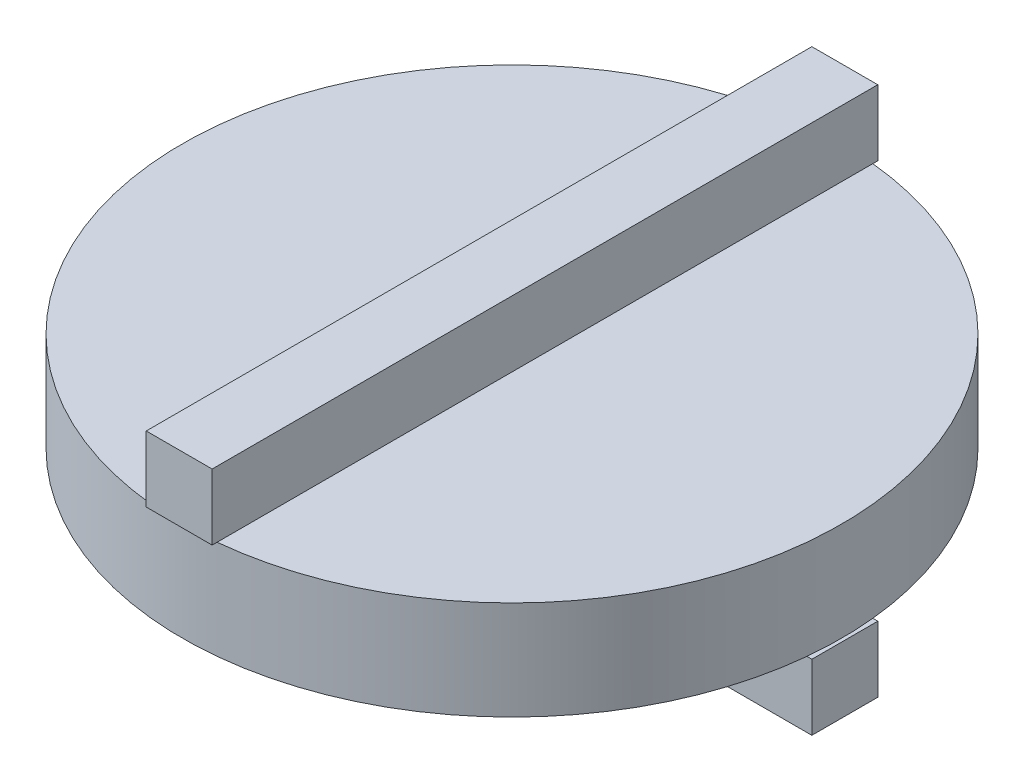
ISO-10303-21;
HEADER;
FILE_DESCRIPTION(('STEP AP214'),'2;1');
FILE_NAME('part.step','',(''),(''),'','','');
FILE_SCHEMA(('AUTOMOTIVE_DESIGN { 1 0 10303 214 1 1 1 1 }'));
ENDSEC;
DATA;
#1=APPLICATION_CONTEXT('core data for automotive mechanical design processes');
#2=APPLICATION_PROTOCOL_DEFINITION('international standard','automotive_design',2000,#1);
#3=PRODUCT_CONTEXT('',#1,'mechanical');
#4=PRODUCT('Part','Part','',(#3));
#5=PRODUCT_RELATED_PRODUCT_CATEGORY('part','',(#4));
#6=PRODUCT_DEFINITION_FORMATION('','',#4);
#7=PRODUCT_DEFINITION_CONTEXT('part definition',#1,'design');
#8=PRODUCT_DEFINITION('design','',#6,#7);
#9=PRODUCT_DEFINITION_SHAPE('','',#8);
#10=(LENGTH_UNIT() NAMED_UNIT(*) SI_UNIT(.MILLI.,.METRE.));
#11=(NAMED_UNIT(*) PLANE_ANGLE_UNIT() SI_UNIT($,.RADIAN.));
#12=(NAMED_UNIT(*) SI_UNIT($,.STERADIAN.) SOLID_ANGLE_UNIT());
#13=UNCERTAINTY_MEASURE_WITH_UNIT(LENGTH_MEASURE(1.E-05),#10,'distance_accuracy_value','');
#14=(GEOMETRIC_REPRESENTATION_CONTEXT(3) GLOBAL_UNCERTAINTY_ASSIGNED_CONTEXT((#13)) GLOBAL_UNIT_ASSIGNED_CONTEXT((#10,
#11,#12)) REPRESENTATION_CONTEXT('',''));
#15=CARTESIAN_POINT('',(0.,0.,0.));
#16=DIRECTION('',(0.,0.,1.));
#17=DIRECTION('',(1.,0.,0.));
#18=AXIS2_PLACEMENT_3D('',#15,#16,#17);
#19=CARTESIAN_POINT('',(0.,0.,0.));
#20=DIRECTION('',(0.,1.,0.));
#21=DIRECTION('',(0.,0.,1.));
#22=AXIS2_PLACEMENT_3D('',#19,#20,#21);
#23=PLANE('',#22);
#24=DIRECTION('',(-1.,0.,0.));
#25=VECTOR('',#24,1.);
#26=CARTESIAN_POINT('',(50.5,0.,5.00000000000001));
#27=LINE('',#26,#25);
#28=CARTESIAN_POINT('',(49.749371855331,0.,5.00000000000001));
#29=VERTEX_POINT('',#28);
#30=CARTESIAN_POINT('',(-49.749371855331,0.,4.99999999999999));
#31=VERTEX_POINT('',#30);
#32=EDGE_CURVE('E11',#29,#31,#27,.T.);
#33=ORIENTED_EDGE('',*,*,#32,.F.);
#34=CARTESIAN_POINT('',(0.,0.,0.));
#35=DIRECTION('',(0.,1.,0.));
#36=DIRECTION('',(0.,0.,1.));
#37=AXIS2_PLACEMENT_3D('',#34,#35,#36);
#38=CIRCLE('',#37,50.);
#39=EDGE_CURVE('E58',#31,#29,#38,.T.);
#40=ORIENTED_EDGE('',*,*,#39,.F.);
#41=EDGE_LOOP('',(#33,#40));
#42=FACE_BOUND('',#41,.T.);
#43=ADVANCED_FACE('F39',(#42),#23,.F.);
#44=DIRECTION('',(1.,0.,0.));
#45=VECTOR('',#44,1.);
#46=CARTESIAN_POINT('',(-50.5,0.,-5.00000000000001));
#47=LINE('',#46,#45);
#48=CARTESIAN_POINT('',(-49.749371855331,0.,-5.00000000000001));
#49=VERTEX_POINT('',#48);
#50=CARTESIAN_POINT('',(49.749371855331,0.,-5.00000000000001));
#51=VERTEX_POINT('',#50);
#52=EDGE_CURVE('E49',#49,#51,#47,.T.);
#53=ORIENTED_EDGE('',*,*,#52,.F.);
#54=EDGE_CURVE('E234',#51,#49,#38,.T.);
#55=ORIENTED_EDGE('',*,*,#54,.F.);
#56=EDGE_LOOP('',(#53,#55));
#57=FACE_BOUND('',#56,.T.);
#58=ADVANCED_FACE('F250',(#57),#23,.F.);
#59=CARTESIAN_POINT('',(0.,15.,0.));
#60=DIRECTION('',(0.,1.,0.));
#61=DIRECTION('',(0.,0.,1.));
#62=AXIS2_PLACEMENT_3D('',#59,#60,#61);
#63=PLANE('',#62);
#64=DIRECTION('',(0.,0.,1.));
#65=VECTOR('',#64,1.);
#66=CARTESIAN_POINT('',(-5.,15.,50.5));
#67=LINE('',#66,#65);
#68=CARTESIAN_POINT('',(-5.,15.,-49.749371855331));
#69=VERTEX_POINT('',#68);
#70=CARTESIAN_POINT('',(-5.,15.,49.749371855331));
#71=VERTEX_POINT('',#70);
#72=EDGE_CURVE('E167',#69,#71,#67,.T.);
#73=ORIENTED_EDGE('',*,*,#72,.F.);
#74=CARTESIAN_POINT('',(0.,15.,0.));
#75=DIRECTION('',(0.,1.,0.));
#76=DIRECTION('',(0.,0.,1.));
#77=AXIS2_PLACEMENT_3D('',#74,#75,#76);
#78=CIRCLE('',#77,50.);
#79=EDGE_CURVE('E225',#69,#71,#78,.T.);
#80=ORIENTED_EDGE('',*,*,#79,.T.);
#81=EDGE_LOOP('',(#73,#80));
#82=FACE_BOUND('',#81,.T.);
#83=ADVANCED_FACE('F254',(#82),#63,.T.);
#84=CARTESIAN_POINT('',(0.,15.,0.));
#85=DIRECTION('',(0.,-1.,0.));
#86=DIRECTION('',(0.,0.,-1.));
#87=AXIS2_PLACEMENT_3D('',#84,#85,#86);
#88=CYLINDRICAL_SURFACE('',#87,50.);
#89=CARTESIAN_POINT('',(5.,15.,49.749371855331));
#90=VERTEX_POINT('',#89);
#91=CARTESIAN_POINT('',(4.99999999999999,15.,-49.749371855331));
#92=VERTEX_POINT('',#91);
#93=EDGE_CURVE('E214',#90,#92,#78,.T.);
#94=ORIENTED_EDGE('',*,*,#93,.F.);
#95=EDGE_CURVE('E217',#71,#90,#78,.T.);
#96=ORIENTED_EDGE('',*,*,#95,.F.);
#97=ORIENTED_EDGE('',*,*,#79,.F.);
#98=EDGE_CURVE('E216',#92,#69,#78,.T.);
#99=ORIENTED_EDGE('',*,*,#98,.F.);
#100=EDGE_LOOP('',(#94,#96,#97,#99));
#101=FACE_BOUND('',#100,.T.);
#102=EDGE_CURVE('E43',#29,#51,#38,.T.);
#103=ORIENTED_EDGE('',*,*,#102,.T.);
#104=ORIENTED_EDGE('',*,*,#54,.T.);
#105=EDGE_CURVE('E238',#49,#31,#38,.T.);
#106=ORIENTED_EDGE('',*,*,#105,.T.);
#107=ORIENTED_EDGE('',*,*,#39,.T.);
#108=EDGE_LOOP('',(#103,#104,#106,#107));
#109=FACE_BOUND('',#108,.T.);
#110=ADVANCED_FACE('F41',(#101,#109),#88,.T.);
#111=DIRECTION('',(0.,0.,-1.));
#112=VECTOR('',#111,1.);
#113=CARTESIAN_POINT('',(4.99999999999999,15.,-50.5));
#114=LINE('',#113,#112);
#115=EDGE_CURVE('E197',#90,#92,#114,.T.);
#116=ORIENTED_EDGE('',*,*,#115,.F.);
#117=ORIENTED_EDGE('',*,*,#93,.T.);
#118=EDGE_LOOP('',(#116,#117));
#119=FACE_BOUND('',#118,.T.);
#120=ADVANCED_FACE('F256',(#119),#63,.T.);
#121=CARTESIAN_POINT('',(0.,15.,0.));
#122=DIRECTION('',(0.,-1.,0.));
#123=DIRECTION('',(0.,0.,-1.));
#124=AXIS2_PLACEMENT_3D('',#121,#122,#123);
#125=PLANE('',#124);
#126=CARTESIAN_POINT('',(4.99999999999999,15.,-50.5));
#127=VERTEX_POINT('',#126);
#128=EDGE_CURVE('E192',#92,#127,#114,.T.);
#129=ORIENTED_EDGE('',*,*,#128,.F.);
#130=ORIENTED_EDGE('',*,*,#98,.T.);
#131=CARTESIAN_POINT('',(-5.,15.,-50.5));
#132=VERTEX_POINT('',#131);
#133=EDGE_CURVE('E165',#132,#69,#67,.T.);
#134=ORIENTED_EDGE('',*,*,#133,.F.);
#135=DIRECTION('',(-1.,0.,0.));
#136=VECTOR('',#135,1.);
#137=CARTESIAN_POINT('',(-5.,15.,-50.5));
#138=LINE('',#137,#136);
#139=EDGE_CURVE('E177',#127,#132,#138,.T.);
#140=ORIENTED_EDGE('',*,*,#139,.F.);
#141=EDGE_LOOP('',(#129,#130,#134,#140));
#142=FACE_BOUND('',#141,.T.);
#143=ADVANCED_FACE('F259',(#142),#125,.T.);
#144=CARTESIAN_POINT('',(-5.,25.,50.5));
#145=DIRECTION('',(1.,0.,0.));
#146=DIRECTION('',(0.,0.,-1.));
#147=AXIS2_PLACEMENT_3D('',#144,#145,#146);
#148=PLANE('',#147);
#149=ORIENTED_EDGE('',*,*,#133,.T.);
#150=ORIENTED_EDGE('',*,*,#72,.T.);
#151=CARTESIAN_POINT('',(-5.,15.,50.5));
#152=VERTEX_POINT('',#151);
#153=EDGE_CURVE('E161',#71,#152,#67,.T.);
#154=ORIENTED_EDGE('',*,*,#153,.T.);
#155=DIRECTION('',(0.,-1.,0.));
#156=VECTOR('',#155,1.);
#157=CARTESIAN_POINT('',(-5.,25.,50.5));
#158=LINE('',#157,#156);
#159=CARTESIAN_POINT('',(-5.,25.,50.5));
#160=VERTEX_POINT('',#159);
#161=EDGE_CURVE('E211',#160,#152,#158,.T.);
#162=ORIENTED_EDGE('',*,*,#161,.F.);
#163=DIRECTION('',(0.,0.,1.));
#164=VECTOR('',#163,1.);
#165=CARTESIAN_POINT('',(-5.,25.,50.5));
#166=LINE('',#165,#164);
#167=CARTESIAN_POINT('',(-5.,25.,-50.5));
#168=VERTEX_POINT('',#167);
#169=EDGE_CURVE('E172',#168,#160,#166,.T.);
#170=ORIENTED_EDGE('',*,*,#169,.F.);
#171=DIRECTION('',(0.,-1.,0.));
#172=VECTOR('',#171,1.);
#173=CARTESIAN_POINT('',(-5.,25.,-50.5));
#174=LINE('',#173,#172);
#175=EDGE_CURVE('E185',#168,#132,#174,.T.);
#176=ORIENTED_EDGE('',*,*,#175,.T.);
#177=EDGE_LOOP('',(#149,#150,#154,#162,#170,#176));
#178=FACE_BOUND('',#177,.T.);
#179=ADVANCED_FACE('F260',(#178),#148,.F.);
#180=CARTESIAN_POINT('',(5.,25.,50.5));
#181=DIRECTION('',(0.,0.,-1.));
#182=DIRECTION('',(-1.,0.,0.));
#183=AXIS2_PLACEMENT_3D('',#180,#181,#182);
#184=PLANE('',#183);
#185=DIRECTION('',(1.,0.,0.));
#186=VECTOR('',#185,1.);
#187=CARTESIAN_POINT('',(5.,15.,50.5));
#188=LINE('',#187,#186);
#189=CARTESIAN_POINT('',(5.,15.,50.5));
#190=VERTEX_POINT('',#189);
#191=EDGE_CURVE('E189',#152,#190,#188,.T.);
#192=ORIENTED_EDGE('',*,*,#191,.T.);
#193=DIRECTION('',(0.,-1.,0.));
#194=VECTOR('',#193,1.);
#195=CARTESIAN_POINT('',(5.,25.,50.5));
#196=LINE('',#195,#194);
#197=CARTESIAN_POINT('',(5.,25.,50.5));
#198=VERTEX_POINT('',#197);
#199=EDGE_CURVE('E207',#198,#190,#196,.T.);
#200=ORIENTED_EDGE('',*,*,#199,.F.);
#201=DIRECTION('',(1.,0.,0.));
#202=VECTOR('',#201,1.);
#203=CARTESIAN_POINT('',(5.,25.,50.5));
#204=LINE('',#203,#202);
#205=EDGE_CURVE('E176',#160,#198,#204,.T.);
#206=ORIENTED_EDGE('',*,*,#205,.F.);
#207=ORIENTED_EDGE('',*,*,#161,.T.);
#208=EDGE_LOOP('',(#192,#200,#206,#207));
#209=FACE_BOUND('',#208,.T.);
#210=ADVANCED_FACE('F263',(#209),#184,.F.);
#211=CARTESIAN_POINT('',(4.99999999999999,25.,-50.5));
#212=DIRECTION('',(-1.,0.,0.));
#213=DIRECTION('',(0.,0.,1.));
#214=AXIS2_PLACEMENT_3D('',#211,#212,#213);
#215=PLANE('',#214);
#216=EDGE_CURVE('E193',#190,#90,#114,.T.);
#217=ORIENTED_EDGE('',*,*,#216,.T.);
#218=ORIENTED_EDGE('',*,*,#115,.T.);
#219=ORIENTED_EDGE('',*,*,#128,.T.);
#220=DIRECTION('',(0.,-1.,0.));
#221=VECTOR('',#220,1.);
#222=CARTESIAN_POINT('',(4.99999999999999,25.,-50.5));
#223=LINE('',#222,#221);
#224=CARTESIAN_POINT('',(4.99999999999999,25.,-50.5));
#225=VERTEX_POINT('',#224);
#226=EDGE_CURVE('E203',#225,#127,#223,.T.);
#227=ORIENTED_EDGE('',*,*,#226,.F.);
#228=DIRECTION('',(0.,0.,-1.));
#229=VECTOR('',#228,1.);
#230=CARTESIAN_POINT('',(4.99999999999999,25.,-50.5));
#231=LINE('',#230,#229);
#232=EDGE_CURVE('E180',#198,#225,#231,.T.);
#233=ORIENTED_EDGE('',*,*,#232,.F.);
#234=ORIENTED_EDGE('',*,*,#199,.T.);
#235=EDGE_LOOP('',(#217,#218,#219,#227,#233,#234));
#236=FACE_BOUND('',#235,.T.);
#237=ADVANCED_FACE('F267',(#236),#215,.F.);
#238=CARTESIAN_POINT('',(-5.,25.,-50.5));
#239=DIRECTION('',(0.,0.,1.));
#240=DIRECTION('',(1.,0.,0.));
#241=AXIS2_PLACEMENT_3D('',#238,#239,#240);
#242=PLANE('',#241);
#243=ORIENTED_EDGE('',*,*,#139,.T.);
#244=ORIENTED_EDGE('',*,*,#175,.F.);
#245=DIRECTION('',(-1.,0.,0.));
#246=VECTOR('',#245,1.);
#247=CARTESIAN_POINT('',(-5.,25.,-50.5));
#248=LINE('',#247,#246);
#249=EDGE_CURVE('E183',#225,#168,#248,.T.);
#250=ORIENTED_EDGE('',*,*,#249,.F.);
#251=ORIENTED_EDGE('',*,*,#226,.T.);
#252=EDGE_LOOP('',(#243,#244,#250,#251));
#253=FACE_BOUND('',#252,.T.);
#254=ADVANCED_FACE('F271',(#253),#242,.F.);
#255=CARTESIAN_POINT('',(0.,25.,0.));
#256=DIRECTION('',(0.,-1.,0.));
#257=DIRECTION('',(0.,0.,-1.));
#258=AXIS2_PLACEMENT_3D('',#255,#256,#257);
#259=PLANE('',#258);
#260=ORIENTED_EDGE('',*,*,#169,.T.);
#261=ORIENTED_EDGE('',*,*,#205,.T.);
#262=ORIENTED_EDGE('',*,*,#232,.T.);
#263=ORIENTED_EDGE('',*,*,#249,.T.);
#264=EDGE_LOOP('',(#260,#261,#262,#263));
#265=FACE_BOUND('',#264,.T.);
#266=ADVANCED_FACE('F275',(#265),#259,.F.);
#267=ORIENTED_EDGE('',*,*,#153,.F.);
#268=ORIENTED_EDGE('',*,*,#95,.T.);
#269=ORIENTED_EDGE('',*,*,#216,.F.);
#270=ORIENTED_EDGE('',*,*,#191,.F.);
#271=EDGE_LOOP('',(#267,#268,#269,#270));
#272=FACE_BOUND('',#271,.T.);
#273=ADVANCED_FACE('F277',(#272),#125,.T.);
#274=CARTESIAN_POINT('',(0.,0.,0.));
#275=DIRECTION('',(0.,-1.,0.));
#276=DIRECTION('',(0.,0.,-1.));
#277=AXIS2_PLACEMENT_3D('',#274,#275,#276);
#278=PLANE('',#277);
#279=ORIENTED_EDGE('',*,*,#102,.F.);
#280=CARTESIAN_POINT('',(50.5,0.,5.00000000000001));
#281=VERTEX_POINT('',#280);
#282=EDGE_CURVE('E51',#281,#29,#27,.T.);
#283=ORIENTED_EDGE('',*,*,#282,.F.);
#284=DIRECTION('',(0.,0.,1.));
#285=VECTOR('',#284,1.);
#286=CARTESIAN_POINT('',(50.5,0.,-5.00000000000001));
#287=LINE('',#286,#285);
#288=CARTESIAN_POINT('',(50.5,0.,-5.00000000000001));
#289=VERTEX_POINT('',#288);
#290=EDGE_CURVE('E154',#289,#281,#287,.T.);
#291=ORIENTED_EDGE('',*,*,#290,.F.);
#292=EDGE_CURVE('E435',#51,#289,#47,.T.);
#293=ORIENTED_EDGE('',*,*,#292,.F.);
#294=EDGE_LOOP('',(#279,#283,#291,#293));
#295=FACE_BOUND('',#294,.T.);
#296=ADVANCED_FACE('F280',(#295),#278,.F.);
#297=CARTESIAN_POINT('',(50.5,-10.,5.00000000000001));
#298=DIRECTION('',(0.,0.,-1.));
#299=DIRECTION('',(-1.,0.,0.));
#300=AXIS2_PLACEMENT_3D('',#297,#298,#299);
#301=PLANE('',#300);
#302=ORIENTED_EDGE('',*,*,#282,.T.);
#303=ORIENTED_EDGE('',*,*,#32,.T.);
#304=CARTESIAN_POINT('',(-50.5,0.,4.99999999999999));
#305=VERTEX_POINT('',#304);
#306=EDGE_CURVE('E52',#31,#305,#27,.T.);
#307=ORIENTED_EDGE('',*,*,#306,.T.);
#308=DIRECTION('',(0.,1.,0.));
#309=VECTOR('',#308,1.);
#310=CARTESIAN_POINT('',(-50.5,-10.,4.99999999999999));
#311=LINE('',#310,#309);
#312=CARTESIAN_POINT('',(-50.5,-10.,4.99999999999999));
#313=VERTEX_POINT('',#312);
#314=EDGE_CURVE('E137',#313,#305,#311,.T.);
#315=ORIENTED_EDGE('',*,*,#314,.F.);
#316=DIRECTION('',(-1.,0.,0.));
#317=VECTOR('',#316,1.);
#318=CARTESIAN_POINT('',(50.5,-10.,5.00000000000001));
#319=LINE('',#318,#317);
#320=CARTESIAN_POINT('',(50.5,-10.,5.00000000000001));
#321=VERTEX_POINT('',#320);
#322=EDGE_CURVE('E144',#321,#313,#319,.T.);
#323=ORIENTED_EDGE('',*,*,#322,.F.);
#324=DIRECTION('',(0.,1.,0.));
#325=VECTOR('',#324,1.);
#326=CARTESIAN_POINT('',(50.5,-10.,5.00000000000001));
#327=LINE('',#326,#325);
#328=EDGE_CURVE('E448',#321,#281,#327,.T.);
#329=ORIENTED_EDGE('',*,*,#328,.T.);
#330=EDGE_LOOP('',(#302,#303,#307,#315,#323,#329));
#331=FACE_BOUND('',#330,.T.);
#332=ADVANCED_FACE('F157',(#331),#301,.F.);
#333=CARTESIAN_POINT('',(-50.5,-10.,4.99999999999999));
#334=DIRECTION('',(1.,0.,0.));
#335=DIRECTION('',(0.,0.,-1.));
#336=AXIS2_PLACEMENT_3D('',#333,#334,#335);
#337=PLANE('',#336);
#338=DIRECTION('',(0.,0.,-1.));
#339=VECTOR('',#338,1.);
#340=CARTESIAN_POINT('',(-50.5,0.,4.99999999999999));
#341=LINE('',#340,#339);
#342=CARTESIAN_POINT('',(-50.5,0.,-5.00000000000001));
#343=VERTEX_POINT('',#342);
#344=EDGE_CURVE('E246',#305,#343,#341,.T.);
#345=ORIENTED_EDGE('',*,*,#344,.T.);
#346=DIRECTION('',(0.,1.,0.));
#347=VECTOR('',#346,1.);
#348=CARTESIAN_POINT('',(-50.5,-10.,-5.00000000000001));
#349=LINE('',#348,#347);
#350=CARTESIAN_POINT('',(-50.5,-10.,-5.00000000000001));
#351=VERTEX_POINT('',#350);
#352=EDGE_CURVE('E139',#351,#343,#349,.T.);
#353=ORIENTED_EDGE('',*,*,#352,.F.);
#354=DIRECTION('',(0.,0.,-1.));
#355=VECTOR('',#354,1.);
#356=CARTESIAN_POINT('',(-50.5,-10.,4.99999999999999));
#357=LINE('',#356,#355);
#358=EDGE_CURVE('E133',#313,#351,#357,.T.);
#359=ORIENTED_EDGE('',*,*,#358,.F.);
#360=ORIENTED_EDGE('',*,*,#314,.T.);
#361=EDGE_LOOP('',(#345,#353,#359,#360));
#362=FACE_BOUND('',#361,.T.);
#363=ADVANCED_FACE('F135',(#362),#337,.F.);
#364=CARTESIAN_POINT('',(-50.5,-10.,-5.00000000000001));
#365=DIRECTION('',(0.,0.,1.));
#366=DIRECTION('',(1.,0.,0.));
#367=AXIS2_PLACEMENT_3D('',#364,#365,#366);
#368=PLANE('',#367);
#369=EDGE_CURVE('E434',#343,#49,#47,.T.);
#370=ORIENTED_EDGE('',*,*,#369,.T.);
#371=ORIENTED_EDGE('',*,*,#52,.T.);
#372=ORIENTED_EDGE('',*,*,#292,.T.);
#373=DIRECTION('',(0.,1.,0.));
#374=VECTOR('',#373,1.);
#375=CARTESIAN_POINT('',(50.5,-10.,-5.00000000000001));
#376=LINE('',#375,#374);
#377=CARTESIAN_POINT('',(50.5,-10.,-5.00000000000001));
#378=VERTEX_POINT('',#377);
#379=EDGE_CURVE('E168',#378,#289,#376,.T.);
#380=ORIENTED_EDGE('',*,*,#379,.F.);
#381=DIRECTION('',(1.,0.,0.));
#382=VECTOR('',#381,1.);
#383=CARTESIAN_POINT('',(-50.5,-10.,-5.00000000000001));
#384=LINE('',#383,#382);
#385=EDGE_CURVE('E143',#351,#378,#384,.T.);
#386=ORIENTED_EDGE('',*,*,#385,.F.);
#387=ORIENTED_EDGE('',*,*,#352,.T.);
#388=EDGE_LOOP('',(#370,#371,#372,#380,#386,#387));
#389=FACE_BOUND('',#388,.T.);
#390=ADVANCED_FACE('F288',(#389),#368,.F.);
#391=CARTESIAN_POINT('',(50.5,-10.,-5.00000000000001));
#392=DIRECTION('',(-1.,0.,0.));
#393=DIRECTION('',(0.,0.,1.));
#394=AXIS2_PLACEMENT_3D('',#391,#392,#393);
#395=PLANE('',#394);
#396=ORIENTED_EDGE('',*,*,#290,.T.);
#397=ORIENTED_EDGE('',*,*,#328,.F.);
#398=DIRECTION('',(0.,0.,1.));
#399=VECTOR('',#398,1.);
#400=CARTESIAN_POINT('',(50.5,-10.,-5.00000000000001));
#401=LINE('',#400,#399);
#402=EDGE_CURVE('E149',#378,#321,#401,.T.);
#403=ORIENTED_EDGE('',*,*,#402,.F.);
#404=ORIENTED_EDGE('',*,*,#379,.T.);
#405=EDGE_LOOP('',(#396,#397,#403,#404));
#406=FACE_BOUND('',#405,.T.);
#407=ADVANCED_FACE('F291',(#406),#395,.F.);
#408=CARTESIAN_POINT('',(0.,-10.,0.));
#409=DIRECTION('',(0.,-1.,0.));
#410=DIRECTION('',(0.,0.,-1.));
#411=AXIS2_PLACEMENT_3D('',#408,#409,#410);
#412=PLANE('',#411);
#413=ORIENTED_EDGE('',*,*,#322,.T.);
#414=ORIENTED_EDGE('',*,*,#358,.T.);
#415=ORIENTED_EDGE('',*,*,#385,.T.);
#416=ORIENTED_EDGE('',*,*,#402,.T.);
#417=EDGE_LOOP('',(#413,#414,#415,#416));
#418=FACE_BOUND('',#417,.T.);
#419=ADVANCED_FACE('F147',(#418),#412,.T.);
#420=ORIENTED_EDGE('',*,*,#105,.F.);
#421=ORIENTED_EDGE('',*,*,#369,.F.);
#422=ORIENTED_EDGE('',*,*,#344,.F.);
#423=ORIENTED_EDGE('',*,*,#306,.F.);
#424=EDGE_LOOP('',(#420,#421,#422,#423));
#425=FACE_BOUND('',#424,.T.);
#426=ADVANCED_FACE('F245',(#425),#278,.F.);
#427=CLOSED_SHELL('',(#43,#58,#83,#110,#120,#143,#179,#210,#237,#254,#266,#273,#296,#332,#363,
#390,#407,#419,#426));
#428=MANIFOLD_SOLID_BREP('B2',#427);
#429=ADVANCED_BREP_SHAPE_REPRESENTATION('',(#18,#428),#14);
#430=SHAPE_DEFINITION_REPRESENTATION(#9,#429);
ENDSEC;
END-ISO-10303-21;
